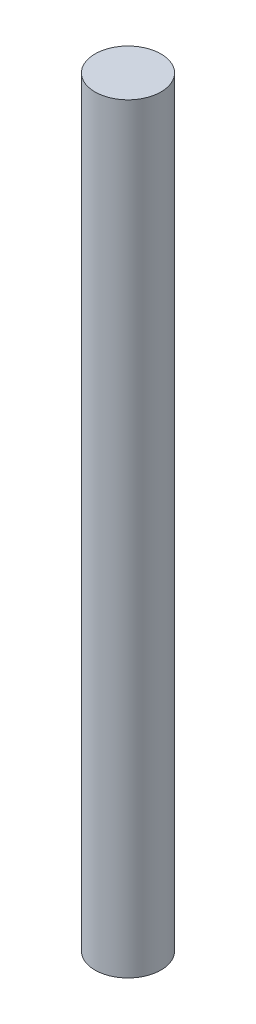
ISO-10303-21;
HEADER;
FILE_DESCRIPTION(('STEP AP214'),'2;1');
FILE_NAME('part.step','',(''),(''),'','','');
FILE_SCHEMA(('AUTOMOTIVE_DESIGN { 1 0 10303 214 1 1 1 1 }'));
ENDSEC;
DATA;
#1=APPLICATION_CONTEXT('core data for automotive mechanical design processes');
#2=APPLICATION_PROTOCOL_DEFINITION('international standard','automotive_design',2000,#1);
#3=PRODUCT_CONTEXT('',#1,'mechanical');
#4=PRODUCT('Part','Part','',(#3));
#5=PRODUCT_RELATED_PRODUCT_CATEGORY('part','',(#4));
#6=PRODUCT_DEFINITION_FORMATION('','',#4);
#7=PRODUCT_DEFINITION_CONTEXT('part definition',#1,'design');
#8=PRODUCT_DEFINITION('design','',#6,#7);
#9=PRODUCT_DEFINITION_SHAPE('','',#8);
#10=(LENGTH_UNIT() NAMED_UNIT(*) SI_UNIT(.MILLI.,.METRE.));
#11=(NAMED_UNIT(*) PLANE_ANGLE_UNIT() SI_UNIT($,.RADIAN.));
#12=(NAMED_UNIT(*) SI_UNIT($,.STERADIAN.) SOLID_ANGLE_UNIT());
#13=UNCERTAINTY_MEASURE_WITH_UNIT(LENGTH_MEASURE(1.E-05),#10,'distance_accuracy_value','');
#14=(GEOMETRIC_REPRESENTATION_CONTEXT(3) GLOBAL_UNCERTAINTY_ASSIGNED_CONTEXT((#13)) GLOBAL_UNIT_ASSIGNED_CONTEXT((#10,
#11,#12)) REPRESENTATION_CONTEXT('',''));
#15=CARTESIAN_POINT('',(0.,0.,0.));
#16=DIRECTION('',(0.,0.,1.));
#17=DIRECTION('',(1.,0.,0.));
#18=AXIS2_PLACEMENT_3D('',#15,#16,#17);
#19=CARTESIAN_POINT('',(0.,79.277972,0.));
#20=DIRECTION('',(0.,-1.,0.));
#21=DIRECTION('',(0.,0.,-1.));
#22=AXIS2_PLACEMENT_3D('',#19,#20,#21);
#23=CYLINDRICAL_SURFACE('',#22,3.4365);
#24=CARTESIAN_POINT('',(0.,79.277972,0.));
#25=DIRECTION('',(0.,1.,0.));
#26=DIRECTION('',(0.,0.,1.));
#27=AXIS2_PLACEMENT_3D('',#24,#25,#26);
#28=CIRCLE('',#27,3.4365);
#29=CARTESIAN_POINT('',(0.,79.277972,3.4365));
#30=VERTEX_POINT('',#29);
#31=EDGE_CURVE('E10',#30,#30,#28,.T.);
#32=ORIENTED_EDGE('',*,*,#31,.F.);
#33=EDGE_LOOP('',(#32));
#34=FACE_BOUND('',#33,.T.);
#35=CARTESIAN_POINT('',(0.,0.,0.));
#36=DIRECTION('',(0.,1.,0.));
#37=DIRECTION('',(0.,0.,1.));
#38=AXIS2_PLACEMENT_3D('',#35,#36,#37);
#39=CIRCLE('',#38,3.4365);
#40=CARTESIAN_POINT('',(0.,0.,3.4365));
#41=VERTEX_POINT('',#40);
#42=EDGE_CURVE('E40',#41,#41,#39,.T.);
#43=ORIENTED_EDGE('',*,*,#42,.T.);
#44=EDGE_LOOP('',(#43));
#45=FACE_BOUND('',#44,.T.);
#46=ADVANCED_FACE('F37',(#34,#45),#23,.T.);
#47=CARTESIAN_POINT('',(0.,79.277972,0.));
#48=DIRECTION('',(0.,1.,0.));
#49=DIRECTION('',(0.,0.,1.));
#50=AXIS2_PLACEMENT_3D('',#47,#48,#49);
#51=PLANE('',#50);
#52=ORIENTED_EDGE('',*,*,#31,.T.);
#53=EDGE_LOOP('',(#52));
#54=FACE_BOUND('',#53,.T.);
#55=ADVANCED_FACE('F52',(#54),#51,.T.);
#56=CARTESIAN_POINT('',(0.,0.,0.));
#57=DIRECTION('',(0.,1.,0.));
#58=DIRECTION('',(0.,0.,1.));
#59=AXIS2_PLACEMENT_3D('',#56,#57,#58);
#60=PLANE('',#59);
#61=ORIENTED_EDGE('',*,*,#42,.F.);
#62=EDGE_LOOP('',(#61));
#63=FACE_BOUND('',#62,.T.);
#64=ADVANCED_FACE('F50',(#63),#60,.F.);
#65=CLOSED_SHELL('',(#46,#55,#64));
#66=MANIFOLD_SOLID_BREP('B2',#65);
#67=ADVANCED_BREP_SHAPE_REPRESENTATION('',(#18,#66),#14);
#68=SHAPE_DEFINITION_REPRESENTATION(#9,#67);
ENDSEC;
END-ISO-10303-21;
